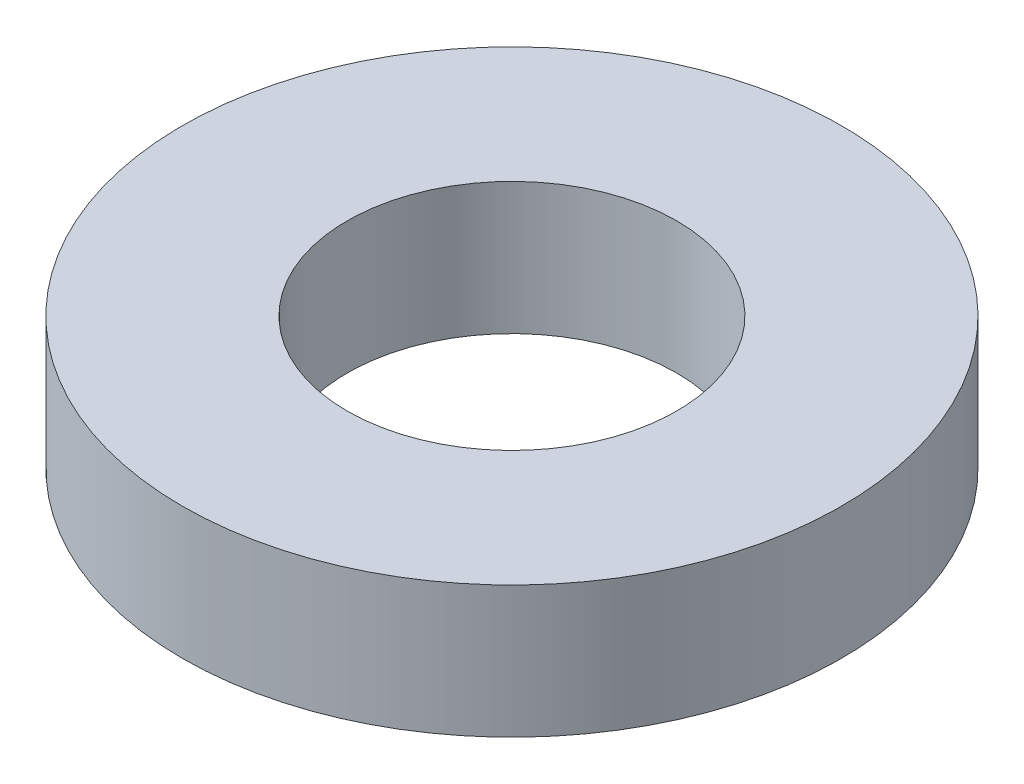
ISO-10303-21;
HEADER;
FILE_DESCRIPTION(('STEP AP214'),'2;1');
FILE_NAME('part.step','',(''),(''),'','','');
FILE_SCHEMA(('AUTOMOTIVE_DESIGN { 1 0 10303 214 1 1 1 1 }'));
ENDSEC;
DATA;
#1=APPLICATION_CONTEXT('core data for automotive mechanical design processes');
#2=APPLICATION_PROTOCOL_DEFINITION('international standard','automotive_design',2000,#1);
#3=PRODUCT_CONTEXT('',#1,'mechanical');
#4=PRODUCT('Part','Part','',(#3));
#5=PRODUCT_RELATED_PRODUCT_CATEGORY('part','',(#4));
#6=PRODUCT_DEFINITION_FORMATION('','',#4);
#7=PRODUCT_DEFINITION_CONTEXT('part definition',#1,'design');
#8=PRODUCT_DEFINITION('design','',#6,#7);
#9=PRODUCT_DEFINITION_SHAPE('','',#8);
#10=(LENGTH_UNIT() NAMED_UNIT(*) SI_UNIT(.MILLI.,.METRE.));
#11=(NAMED_UNIT(*) PLANE_ANGLE_UNIT() SI_UNIT($,.RADIAN.));
#12=(NAMED_UNIT(*) SI_UNIT($,.STERADIAN.) SOLID_ANGLE_UNIT());
#13=UNCERTAINTY_MEASURE_WITH_UNIT(LENGTH_MEASURE(1.E-05),#10,'distance_accuracy_value','');
#14=(GEOMETRIC_REPRESENTATION_CONTEXT(3) GLOBAL_UNCERTAINTY_ASSIGNED_CONTEXT((#13)) GLOBAL_UNIT_ASSIGNED_CONTEXT((#10,
#11,#12)) REPRESENTATION_CONTEXT('',''));
#15=CARTESIAN_POINT('',(0.,0.,0.));
#16=DIRECTION('',(0.,0.,1.));
#17=DIRECTION('',(1.,0.,0.));
#18=AXIS2_PLACEMENT_3D('',#15,#16,#17);
#19=CARTESIAN_POINT('',(0.,2.54,0.));
#20=DIRECTION('',(0.,1.,0.));
#21=DIRECTION('',(0.,0.,1.));
#22=AXIS2_PLACEMENT_3D('',#19,#20,#21);
#23=PLANE('',#22);
#24=CARTESIAN_POINT('',(0.,2.54,0.));
#25=DIRECTION('',(0.,1.,0.));
#26=DIRECTION('',(0.,0.,1.));
#27=AXIS2_PLACEMENT_3D('',#24,#25,#26);
#28=CIRCLE('',#27,6.35);
#29=CARTESIAN_POINT('',(0.,2.54,6.35));
#30=VERTEX_POINT('',#29);
#31=EDGE_CURVE('E10',#30,#30,#28,.T.);
#32=ORIENTED_EDGE('',*,*,#31,.T.);
#33=EDGE_LOOP('',(#32));
#34=FACE_BOUND('',#33,.T.);
#35=CARTESIAN_POINT('',(0.,2.54,0.));
#36=DIRECTION('',(0.,1.,0.));
#37=DIRECTION('',(0.,0.,1.));
#38=AXIS2_PLACEMENT_3D('',#35,#36,#37);
#39=CIRCLE('',#38,3.175);
#40=CARTESIAN_POINT('',(0.,2.54,3.175));
#41=VERTEX_POINT('',#40);
#42=EDGE_CURVE('E41',#41,#41,#39,.T.);
#43=ORIENTED_EDGE('',*,*,#42,.F.);
#44=EDGE_LOOP('',(#43));
#45=FACE_BOUND('',#44,.T.);
#46=ADVANCED_FACE('F30',(#34,#45),#23,.T.);
#47=CARTESIAN_POINT('',(0.,0.,0.));
#48=DIRECTION('',(0.,1.,0.));
#49=DIRECTION('',(0.,0.,1.));
#50=AXIS2_PLACEMENT_3D('',#47,#48,#49);
#51=PLANE('',#50);
#52=CARTESIAN_POINT('',(0.,0.,0.));
#53=DIRECTION('',(0.,1.,0.));
#54=DIRECTION('',(0.,0.,1.));
#55=AXIS2_PLACEMENT_3D('',#52,#53,#54);
#56=CIRCLE('',#55,6.35);
#57=CARTESIAN_POINT('',(0.,0.,6.35));
#58=VERTEX_POINT('',#57);
#59=EDGE_CURVE('E34',#58,#58,#56,.T.);
#60=ORIENTED_EDGE('',*,*,#59,.F.);
#61=EDGE_LOOP('',(#60));
#62=FACE_BOUND('',#61,.T.);
#63=CARTESIAN_POINT('',(0.,0.,0.));
#64=DIRECTION('',(0.,1.,0.));
#65=DIRECTION('',(0.,0.,1.));
#66=AXIS2_PLACEMENT_3D('',#63,#64,#65);
#67=CIRCLE('',#66,3.175);
#68=CARTESIAN_POINT('',(0.,0.,3.175));
#69=VERTEX_POINT('',#68);
#70=EDGE_CURVE('E43',#69,#69,#67,.T.);
#71=ORIENTED_EDGE('',*,*,#70,.T.);
#72=EDGE_LOOP('',(#71));
#73=FACE_BOUND('',#72,.T.);
#74=ADVANCED_FACE('F53',(#62,#73),#51,.F.);
#75=CARTESIAN_POINT('',(0.,2.54,0.));
#76=DIRECTION('',(0.,-1.,0.));
#77=DIRECTION('',(0.,0.,-1.));
#78=AXIS2_PLACEMENT_3D('',#75,#76,#77);
#79=CYLINDRICAL_SURFACE('',#78,6.35);
#80=ORIENTED_EDGE('',*,*,#31,.F.);
#81=EDGE_LOOP('',(#80));
#82=FACE_BOUND('',#81,.T.);
#83=ORIENTED_EDGE('',*,*,#59,.T.);
#84=EDGE_LOOP('',(#83));
#85=FACE_BOUND('',#84,.T.);
#86=ADVANCED_FACE('F32',(#82,#85),#79,.T.);
#87=CARTESIAN_POINT('',(0.,2.54,0.));
#88=DIRECTION('',(0.,-1.,0.));
#89=DIRECTION('',(0.,0.,-1.));
#90=AXIS2_PLACEMENT_3D('',#87,#88,#89);
#91=CYLINDRICAL_SURFACE('',#90,3.175);
#92=ORIENTED_EDGE('',*,*,#42,.T.);
#93=EDGE_LOOP('',(#92));
#94=FACE_BOUND('',#93,.T.);
#95=ORIENTED_EDGE('',*,*,#70,.F.);
#96=EDGE_LOOP('',(#95));
#97=FACE_BOUND('',#96,.T.);
#98=ADVANCED_FACE('F49',(#94,#97),#91,.F.);
#99=CLOSED_SHELL('',(#46,#74,#86,#98));
#100=MANIFOLD_SOLID_BREP('B2',#99);
#101=ADVANCED_BREP_SHAPE_REPRESENTATION('',(#18,#100),#14);
#102=SHAPE_DEFINITION_REPRESENTATION(#9,#101);
ENDSEC;
END-ISO-10303-21;
